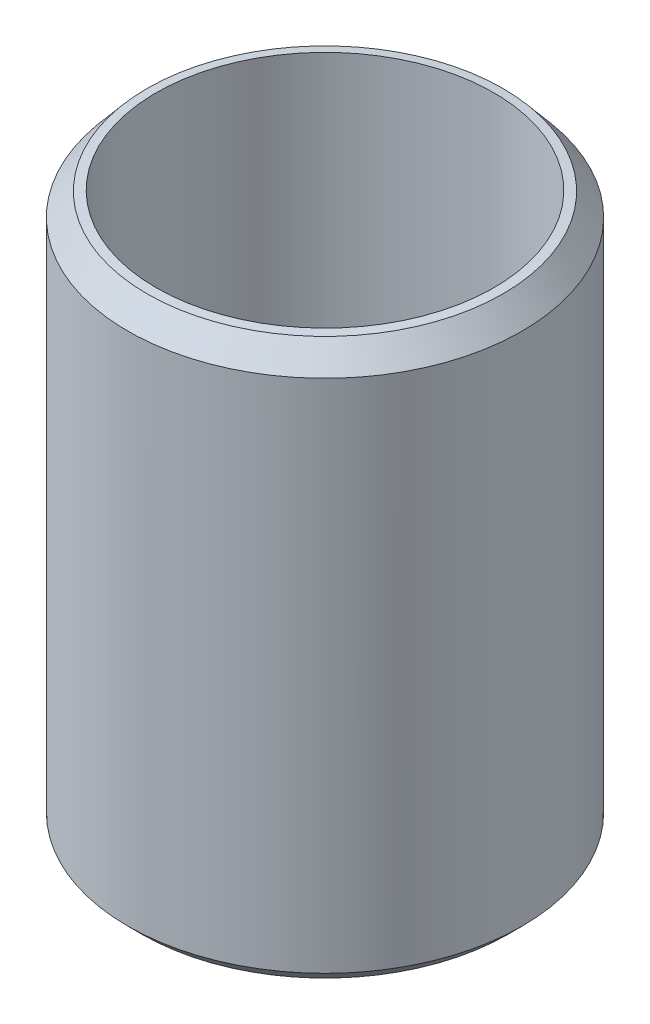
ISO-10303-21;
HEADER;
FILE_DESCRIPTION(('STEP AP214'),'2;1');
FILE_NAME('part.step','',(''),(''),'','','');
FILE_SCHEMA(('AUTOMOTIVE_DESIGN { 1 0 10303 214 1 1 1 1 }'));
ENDSEC;
DATA;
#1=APPLICATION_CONTEXT('core data for automotive mechanical design processes');
#2=APPLICATION_PROTOCOL_DEFINITION('international standard','automotive_design',2000,#1);
#3=PRODUCT_CONTEXT('',#1,'mechanical');
#4=PRODUCT('Part','Part','',(#3));
#5=PRODUCT_RELATED_PRODUCT_CATEGORY('part','',(#4));
#6=PRODUCT_DEFINITION_FORMATION('','',#4);
#7=PRODUCT_DEFINITION_CONTEXT('part definition',#1,'design');
#8=PRODUCT_DEFINITION('design','',#6,#7);
#9=PRODUCT_DEFINITION_SHAPE('','',#8);
#10=(LENGTH_UNIT() NAMED_UNIT(*) SI_UNIT(.MILLI.,.METRE.));
#11=(NAMED_UNIT(*) PLANE_ANGLE_UNIT() SI_UNIT($,.RADIAN.));
#12=(NAMED_UNIT(*) SI_UNIT($,.STERADIAN.) SOLID_ANGLE_UNIT());
#13=UNCERTAINTY_MEASURE_WITH_UNIT(LENGTH_MEASURE(1.E-05),#10,'distance_accuracy_value','');
#14=(GEOMETRIC_REPRESENTATION_CONTEXT(3) GLOBAL_UNCERTAINTY_ASSIGNED_CONTEXT((#13)) GLOBAL_UNIT_ASSIGNED_CONTEXT((#10,
#11,#12)) REPRESENTATION_CONTEXT('',''));
#15=CARTESIAN_POINT('',(0.,0.,0.));
#16=DIRECTION('',(0.,0.,1.));
#17=DIRECTION('',(1.,0.,0.));
#18=AXIS2_PLACEMENT_3D('',#15,#16,#17);
#19=CARTESIAN_POINT('',(0.,20.,0.));
#20=DIRECTION('',(0.,-1.,0.));
#21=DIRECTION('',(0.,0.,-1.));
#22=AXIS2_PLACEMENT_3D('',#19,#20,#21);
#23=CONICAL_SURFACE('',#22,6.,0.698131700797727);
#24=CARTESIAN_POINT('',(0.,19.6169777784405,0.));
#25=DIRECTION('',(0.,1.,0.));
#26=DIRECTION('',(0.,0.,1.));
#27=AXIS2_PLACEMENT_3D('',#24,#25,#26);
#28=CIRCLE('',#27,6.32139380484327);
#29=CARTESIAN_POINT('',(0.,19.6169777784405,6.32139380484327));
#30=VERTEX_POINT('',#29);
#31=EDGE_CURVE('E10',#30,#30,#28,.F.);
#32=ORIENTED_EDGE('',*,*,#31,.T.);
#33=EDGE_LOOP('',(#32));
#34=FACE_BOUND('',#33,.T.);
#35=CARTESIAN_POINT('',(0.,18.8082464074058,0.));
#36=DIRECTION('',(0.,-1.,0.));
#37=DIRECTION('',(0.,0.,-1.));
#38=AXIS2_PLACEMENT_3D('',#35,#36,#37);
#39=CIRCLE('',#38,7.);
#40=CARTESIAN_POINT('',(0.,18.8082464074058,-7.));
#41=VERTEX_POINT('',#40);
#42=EDGE_CURVE('E62',#41,#41,#39,.T.);
#43=ORIENTED_EDGE('',*,*,#42,.F.);
#44=EDGE_LOOP('',(#43));
#45=FACE_BOUND('',#44,.T.);
#46=ADVANCED_FACE('F41',(#34,#45),#23,.T.);
#47=CARTESIAN_POINT('',(0.,0.,0.));
#48=DIRECTION('',(0.,-1.,0.));
#49=DIRECTION('',(0.,0.,-1.));
#50=AXIS2_PLACEMENT_3D('',#47,#48,#49);
#51=CYLINDRICAL_SURFACE('',#50,7.);
#52=CARTESIAN_POINT('',(0.,0.5,0.));
#53=DIRECTION('',(0.,1.,0.));
#54=DIRECTION('',(0.,0.,1.));
#55=AXIS2_PLACEMENT_3D('',#52,#53,#54);
#56=CIRCLE('',#55,7.);
#57=CARTESIAN_POINT('',(0.,0.5,7.));
#58=VERTEX_POINT('',#57);
#59=EDGE_CURVE('E59',#58,#58,#56,.T.);
#60=ORIENTED_EDGE('',*,*,#59,.T.);
#61=EDGE_LOOP('',(#60));
#62=FACE_BOUND('',#61,.T.);
#63=ORIENTED_EDGE('',*,*,#42,.T.);
#64=EDGE_LOOP('',(#63));
#65=FACE_BOUND('',#64,.T.);
#66=ADVANCED_FACE('F81',(#62,#65),#51,.T.);
#67=CARTESIAN_POINT('',(0.,-40.,0.));
#68=DIRECTION('',(0.,1.,0.));
#69=DIRECTION('',(0.,0.,1.));
#70=AXIS2_PLACEMENT_3D('',#67,#68,#69);
#71=CYLINDRICAL_SURFACE('',#70,6.);
#72=CARTESIAN_POINT('',(0.,0.49999999999998,0.));
#73=DIRECTION('',(0.,1.,0.));
#74=DIRECTION('',(0.,0.,1.));
#75=AXIS2_PLACEMENT_3D('',#72,#73,#74);
#76=CIRCLE('',#75,6.);
#77=CARTESIAN_POINT('',(0.,0.49999999999998,6.));
#78=VERTEX_POINT('',#77);
#79=EDGE_CURVE('E50',#78,#78,#76,.F.);
#80=CARTESIAN_POINT('',(0.,19.6450960928918,0.));
#81=DIRECTION('',(0.,-1.,0.));
#82=DIRECTION('',(0.,0.,-1.));
#83=AXIS2_PLACEMENT_3D('',#80,#81,#82);
#84=CIRCLE('',#83,6.);
#85=CARTESIAN_POINT('',(0.,19.6450960928918,6.));
#86=VERTEX_POINT('',#85);
#87=EDGE_CURVE('E54',#86,#86,#84,.F.);
#88=CARTESIAN_POINT('',(0.,0.49999999999998,6.));
#89=CARTESIAN_POINT('',(0.,0.699428084300936,6.));
#90=CARTESIAN_POINT('',(0.,0.898856168601893,6.));
#91=CARTESIAN_POINT('',(0.,1.29771233720381,6.));
#92=CARTESIAN_POINT('',(0.,1.49714042150476,6.));
#93=CARTESIAN_POINT('',(0.,1.89599659010667,6.));
#94=CARTESIAN_POINT('',(0.,2.09542467440763,6.));
#95=CARTESIAN_POINT('',(0.,2.49428084300954,6.));
#96=CARTESIAN_POINT('',(0.,2.6937089273105,6.));
#97=CARTESIAN_POINT('',(0.,3.09256509591241,6.));
#98=CARTESIAN_POINT('',(0.,3.29199318021336,6.));
#99=CARTESIAN_POINT('',(0.,3.69084934881528,6.));
#100=CARTESIAN_POINT('',(0.,3.89027743311623,6.));
#101=CARTESIAN_POINT('',(0.,4.28913360171814,6.));
#102=CARTESIAN_POINT('',(0.,4.4885616860191,6.));
#103=CARTESIAN_POINT('',(0.,4.88741785462101,6.));
#104=CARTESIAN_POINT('',(0.,5.08684593892197,6.));
#105=CARTESIAN_POINT('',(0.,5.48570210752388,6.));
#106=CARTESIAN_POINT('',(0.,5.68513019182484,6.));
#107=CARTESIAN_POINT('',(0.,6.08398636042675,6.));
#108=CARTESIAN_POINT('',(0.,6.28341444472771,6.));
#109=CARTESIAN_POINT('',(0.,6.68227061332962,6.));
#110=CARTESIAN_POINT('',(0.,6.88169869763057,6.));
#111=CARTESIAN_POINT('',(0.,7.28055486623248,6.));
#112=CARTESIAN_POINT('',(0.,7.47998295053344,6.));
#113=CARTESIAN_POINT('',(0.,7.87883911913535,6.));
#114=CARTESIAN_POINT('',(0.,8.07826720343631,6.));
#115=CARTESIAN_POINT('',(0.,8.47712337203822,6.));
#116=CARTESIAN_POINT('',(0.,8.67655145633917,6.));
#117=CARTESIAN_POINT('',(0.,9.07540762494109,6.));
#118=CARTESIAN_POINT('',(0.,9.27483570924204,6.));
#119=CARTESIAN_POINT('',(0.,9.67369187784396,6.));
#120=CARTESIAN_POINT('',(0.,9.87311996214491,6.));
#121=CARTESIAN_POINT('',(0.,10.2719761307468,6.));
#122=CARTESIAN_POINT('',(0.,10.4714042150478,6.));
#123=CARTESIAN_POINT('',(0.,10.8702603836497,6.));
#124=CARTESIAN_POINT('',(0.,11.0696884679507,6.));
#125=CARTESIAN_POINT('',(0.,11.4685446365526,6.));
#126=CARTESIAN_POINT('',(0.,11.6679727208535,6.));
#127=CARTESIAN_POINT('',(0.,12.0668288894554,6.));
#128=CARTESIAN_POINT('',(0.,12.2662569737564,6.));
#129=CARTESIAN_POINT('',(0.,12.6651131423583,6.));
#130=CARTESIAN_POINT('',(0.,12.8645412266593,6.));
#131=CARTESIAN_POINT('',(0.,13.2633973952612,6.));
#132=CARTESIAN_POINT('',(0.,13.4628254795621,6.));
#133=CARTESIAN_POINT('',(0.,13.861681648164,6.));
#134=CARTESIAN_POINT('',(0.,14.061109732465,6.));
#135=CARTESIAN_POINT('',(0.,14.4599659010669,6.));
#136=CARTESIAN_POINT('',(0.,14.6593939853679,6.));
#137=CARTESIAN_POINT('',(0.,15.0582501539698,6.));
#138=CARTESIAN_POINT('',(0.,15.2576782382707,6.));
#139=CARTESIAN_POINT('',(0.,15.6565344068726,6.));
#140=CARTESIAN_POINT('',(0.,15.8559624911736,6.));
#141=CARTESIAN_POINT('',(0.,16.2548186597755,6.));
#142=CARTESIAN_POINT('',(0.,16.4542467440765,6.));
#143=CARTESIAN_POINT('',(0.,16.8531029126784,6.));
#144=CARTESIAN_POINT('',(0.,17.0525309969793,6.));
#145=CARTESIAN_POINT('',(0.,17.4513871655812,6.));
#146=CARTESIAN_POINT('',(0.,17.6508152498822,6.));
#147=CARTESIAN_POINT('',(0.,18.0496714184841,6.));
#148=CARTESIAN_POINT('',(0.,18.2490995027851,6.));
#149=CARTESIAN_POINT('',(0.,18.647955671387,6.));
#150=CARTESIAN_POINT('',(0.,18.8473837556879,6.));
#151=CARTESIAN_POINT('',(0.,19.2462399242898,6.));
#152=CARTESIAN_POINT('',(0.,19.4456680085908,6.));
#153=CARTESIAN_POINT('',(0.,19.6450960928918,6.));
#154=B_SPLINE_CURVE_WITH_KNOTS('',3,(#88,#89,#90,#91,#92,#93,#94,#95,#96,#97,#98,#99,#100,#101,
#102,#103,#104,#105,#106,#107,#108,#109,#110,#111,#112,#113,#114,#115,#116,#117,#118,#119,#120,
#121,#122,#123,#124,#125,#126,#127,#128,#129,#130,#131,#132,#133,#134,#135,#136,#137,#138,#139,
#140,#141,#142,#143,#144,#145,#146,#147,#148,#149,#150,#151,#152,#153),.UNSPECIFIED.,.F.,.F.,(4,
2,2,2,2,2,2,2,2,2,2,2,2,2,2,2,2,2,2,2,2,2,2,2,2,2,2,2,2,2,2,2,4),(0.,0.59828425290287,
1.19656850580574,1.7948527587086,2.39313701161147,2.99142126451434,3.58970551741721,
4.18798977032007,4.78627402322294,5.38455827612581,5.98284252902868,6.58112678193155,
7.17941103483442,7.77769528773729,8.37597954064015,8.97426379354302,9.57254804644589,
10.1708322993488,10.7691165522516,11.3674008051545,11.9656850580574,12.5639693109602,
13.1622535638631,13.760537816766,14.3588220696688,14.9571063225717,15.5553905754746,
16.1536748283774,16.7519590812803,17.3502433341832,17.948527587086,18.5468118399889,
19.1450960928918),.UNSPECIFIED.);
#155=EDGE_CURVE('BSEAM73',#78,#86,#154,.T.);
#156=ORIENTED_EDGE('',*,*,#79,.T.);
#157=ORIENTED_EDGE('',*,*,#87,.T.);
#158=ORIENTED_EDGE('',*,*,#155,.T.);
#159=ORIENTED_EDGE('',*,*,#155,.F.);
#160=EDGE_LOOP('',(#156,#158,#157,#159));
#161=FACE_BOUND('',#160,.T.);
#162=ADVANCED_FACE('F73',(#161),#71,.F.);
#163=CARTESIAN_POINT('',(0.,0.,0.));
#164=DIRECTION('',(0.,-1.,0.));
#165=DIRECTION('',(0.,0.,-1.));
#166=AXIS2_PLACEMENT_3D('',#163,#164,#165);
#167=CONICAL_SURFACE('',#166,6.49999999999998,0.785398163397445);
#168=ORIENTED_EDGE('',*,*,#79,.F.);
#169=EDGE_LOOP('',(#168));
#170=FACE_BOUND('',#169,.T.);
#171=CARTESIAN_POINT('',(0.,0.,0.));
#172=DIRECTION('',(0.,1.,0.));
#173=DIRECTION('',(0.,0.,1.));
#174=AXIS2_PLACEMENT_3D('',#171,#172,#173);
#175=CIRCLE('',#174,6.49999999999998);
#176=CARTESIAN_POINT('',(0.,0.,6.49999999999998));
#177=VERTEX_POINT('',#176);
#178=EDGE_CURVE('E46',#177,#177,#175,.T.);
#179=ORIENTED_EDGE('',*,*,#178,.F.);
#180=EDGE_LOOP('',(#179));
#181=FACE_BOUND('',#180,.T.);
#182=ADVANCED_FACE('F71',(#170,#181),#167,.F.);
#183=CARTESIAN_POINT('',(0.,0.,0.));
#184=DIRECTION('',(0.,1.,0.));
#185=DIRECTION('',(0.,0.,1.));
#186=AXIS2_PLACEMENT_3D('',#183,#184,#185);
#187=CONICAL_SURFACE('',#186,6.5,0.785398163397448);
#188=ORIENTED_EDGE('',*,*,#59,.F.);
#189=EDGE_LOOP('',(#188));
#190=FACE_BOUND('',#189,.T.);
#191=ORIENTED_EDGE('',*,*,#178,.T.);
#192=EDGE_LOOP('',(#191));
#193=FACE_BOUND('',#192,.T.);
#194=ADVANCED_FACE('F69',(#190,#193),#187,.T.);
#195=CARTESIAN_POINT('',(0.,19.6450960928918,0.));
#196=DIRECTION('',(0.,-1.,0.));
#197=DIRECTION('',(0.,0.,-1.));
#198=AXIS2_PLACEMENT_3D('',#195,#196,#197);
#199=CONICAL_SURFACE('',#198,6.,1.48352986419517);
#200=ORIENTED_EDGE('',*,*,#31,.F.);
#201=EDGE_LOOP('',(#200));
#202=FACE_BOUND('',#201,.T.);
#203=ORIENTED_EDGE('',*,*,#87,.F.);
#204=EDGE_LOOP('',(#203));
#205=FACE_BOUND('',#204,.T.);
#206=ADVANCED_FACE('F44',(#202,#205),#199,.T.);
#207=CLOSED_SHELL('',(#46,#66,#162,#182,#194,#206));
#208=MANIFOLD_SOLID_BREP('B2',#207);
#209=ADVANCED_BREP_SHAPE_REPRESENTATION('',(#18,#208),#14);
#210=SHAPE_DEFINITION_REPRESENTATION(#9,#209);
ENDSEC;
END-ISO-10303-21;
